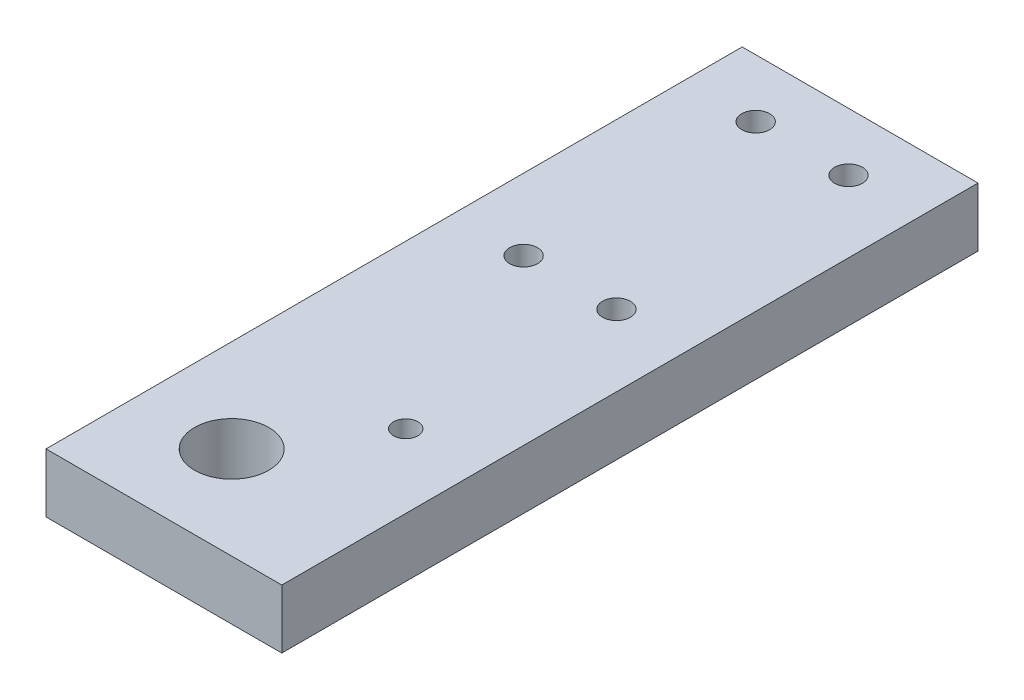
ISO-10303-21;
HEADER;
FILE_DESCRIPTION(('STEP AP214'),'2;1');
FILE_NAME('part.step','',(''),(''),'','','');
FILE_SCHEMA(('AUTOMOTIVE_DESIGN { 1 0 10303 214 1 1 1 1 }'));
ENDSEC;
DATA;
#1=APPLICATION_CONTEXT('core data for automotive mechanical design processes');
#2=APPLICATION_PROTOCOL_DEFINITION('international standard','automotive_design',2000,#1);
#3=PRODUCT_CONTEXT('',#1,'mechanical');
#4=PRODUCT('Part','Part','',(#3));
#5=PRODUCT_RELATED_PRODUCT_CATEGORY('part','',(#4));
#6=PRODUCT_DEFINITION_FORMATION('','',#4);
#7=PRODUCT_DEFINITION_CONTEXT('part definition',#1,'design');
#8=PRODUCT_DEFINITION('design','',#6,#7);
#9=PRODUCT_DEFINITION_SHAPE('','',#8);
#10=(LENGTH_UNIT() NAMED_UNIT(*) SI_UNIT(.MILLI.,.METRE.));
#11=(NAMED_UNIT(*) PLANE_ANGLE_UNIT() SI_UNIT($,.RADIAN.));
#12=(NAMED_UNIT(*) SI_UNIT($,.STERADIAN.) SOLID_ANGLE_UNIT());
#13=UNCERTAINTY_MEASURE_WITH_UNIT(LENGTH_MEASURE(1.E-05),#10,'distance_accuracy_value','');
#14=(GEOMETRIC_REPRESENTATION_CONTEXT(3) GLOBAL_UNCERTAINTY_ASSIGNED_CONTEXT((#13)) GLOBAL_UNIT_ASSIGNED_CONTEXT((#10,
#11,#12)) REPRESENTATION_CONTEXT('',''));
#15=CARTESIAN_POINT('',(0.,0.,0.));
#16=DIRECTION('',(0.,0.,1.));
#17=DIRECTION('',(1.,0.,0.));
#18=AXIS2_PLACEMENT_3D('',#15,#16,#17);
#19=CARTESIAN_POINT('',(0.,25.4,0.));
#20=DIRECTION('',(1.,0.,0.));
#21=DIRECTION('',(0.,0.,-1.));
#22=AXIS2_PLACEMENT_3D('',#19,#20,#21);
#23=PLANE('',#22);
#24=DIRECTION('',(0.,0.,1.));
#25=VECTOR('',#24,1.);
#26=CARTESIAN_POINT('',(0.,0.,0.));
#27=LINE('',#26,#25);
#28=CARTESIAN_POINT('',(0.,0.,-300.));
#29=VERTEX_POINT('',#28);
#30=CARTESIAN_POINT('',(0.,0.,0.));
#31=VERTEX_POINT('',#30);
#32=EDGE_CURVE('E94',#29,#31,#27,.T.);
#33=ORIENTED_EDGE('',*,*,#32,.T.);
#34=DIRECTION('',(0.,-1.,0.));
#35=VECTOR('',#34,1.);
#36=CARTESIAN_POINT('',(0.,25.4,0.));
#37=LINE('',#36,#35);
#38=CARTESIAN_POINT('',(0.,25.4,0.));
#39=VERTEX_POINT('',#38);
#40=EDGE_CURVE('E11',#39,#31,#37,.T.);
#41=ORIENTED_EDGE('',*,*,#40,.F.);
#42=DIRECTION('',(0.,0.,1.));
#43=VECTOR('',#42,1.);
#44=CARTESIAN_POINT('',(0.,25.4,0.));
#45=LINE('',#44,#43);
#46=CARTESIAN_POINT('',(0.,25.4,-300.));
#47=VERTEX_POINT('',#46);
#48=EDGE_CURVE('E82',#47,#39,#45,.T.);
#49=ORIENTED_EDGE('',*,*,#48,.F.);
#50=DIRECTION('',(0.,-1.,0.));
#51=VECTOR('',#50,1.);
#52=CARTESIAN_POINT('',(0.,25.4,-300.));
#53=LINE('',#52,#51);
#54=EDGE_CURVE('E90',#47,#29,#53,.T.);
#55=ORIENTED_EDGE('',*,*,#54,.T.);
#56=EDGE_LOOP('',(#33,#41,#49,#55));
#57=FACE_BOUND('',#56,.T.);
#58=ADVANCED_FACE('F31',(#57),#23,.F.);
#59=CARTESIAN_POINT('',(0.,25.4,0.));
#60=DIRECTION('',(0.,0.,-1.));
#61=DIRECTION('',(-1.,0.,0.));
#62=AXIS2_PLACEMENT_3D('',#59,#60,#61);
#63=PLANE('',#62);
#64=DIRECTION('',(1.,0.,0.));
#65=VECTOR('',#64,1.);
#66=CARTESIAN_POINT('',(0.,0.,0.));
#67=LINE('',#66,#65);
#68=CARTESIAN_POINT('',(101.6,0.,0.));
#69=VERTEX_POINT('',#68);
#70=EDGE_CURVE('E86',#31,#69,#67,.T.);
#71=ORIENTED_EDGE('',*,*,#70,.T.);
#72=DIRECTION('',(0.,-1.,0.));
#73=VECTOR('',#72,1.);
#74=CARTESIAN_POINT('',(101.6,25.4,0.));
#75=LINE('',#74,#73);
#76=CARTESIAN_POINT('',(101.6,25.4,0.));
#77=VERTEX_POINT('',#76);
#78=EDGE_CURVE('E39',#77,#69,#75,.T.);
#79=ORIENTED_EDGE('',*,*,#78,.F.);
#80=DIRECTION('',(1.,0.,0.));
#81=VECTOR('',#80,1.);
#82=CARTESIAN_POINT('',(0.,25.4,0.));
#83=LINE('',#82,#81);
#84=EDGE_CURVE('E77',#39,#77,#83,.T.);
#85=ORIENTED_EDGE('',*,*,#84,.F.);
#86=ORIENTED_EDGE('',*,*,#40,.T.);
#87=EDGE_LOOP('',(#71,#79,#85,#86));
#88=FACE_BOUND('',#87,.T.);
#89=ADVANCED_FACE('F85',(#88),#63,.F.);
#90=CARTESIAN_POINT('',(101.6,25.4,0.));
#91=DIRECTION('',(-1.,0.,0.));
#92=DIRECTION('',(0.,0.,1.));
#93=AXIS2_PLACEMENT_3D('',#90,#91,#92);
#94=PLANE('',#93);
#95=DIRECTION('',(0.,0.,-1.));
#96=VECTOR('',#95,1.);
#97=CARTESIAN_POINT('',(101.6,0.,0.));
#98=LINE('',#97,#96);
#99=CARTESIAN_POINT('',(101.6,0.,-300.));
#100=VERTEX_POINT('',#99);
#101=EDGE_CURVE('E64',#69,#100,#98,.T.);
#102=ORIENTED_EDGE('',*,*,#101,.T.);
#103=DIRECTION('',(0.,-1.,0.));
#104=VECTOR('',#103,1.);
#105=CARTESIAN_POINT('',(101.6,25.4,-300.));
#106=LINE('',#105,#104);
#107=CARTESIAN_POINT('',(101.6,25.4,-300.));
#108=VERTEX_POINT('',#107);
#109=EDGE_CURVE('E87',#108,#100,#106,.T.);
#110=ORIENTED_EDGE('',*,*,#109,.F.);
#111=DIRECTION('',(0.,0.,-1.));
#112=VECTOR('',#111,1.);
#113=CARTESIAN_POINT('',(101.6,25.4,0.));
#114=LINE('',#113,#112);
#115=EDGE_CURVE('E80',#77,#108,#114,.T.);
#116=ORIENTED_EDGE('',*,*,#115,.F.);
#117=ORIENTED_EDGE('',*,*,#78,.T.);
#118=EDGE_LOOP('',(#102,#110,#116,#117));
#119=FACE_BOUND('',#118,.T.);
#120=ADVANCED_FACE('F88',(#119),#94,.F.);
#121=CARTESIAN_POINT('',(0.,25.4,-300.));
#122=DIRECTION('',(0.,0.,1.));
#123=DIRECTION('',(1.,0.,0.));
#124=AXIS2_PLACEMENT_3D('',#121,#122,#123);
#125=PLANE('',#124);
#126=DIRECTION('',(-1.,0.,0.));
#127=VECTOR('',#126,1.);
#128=CARTESIAN_POINT('',(0.,0.,-300.));
#129=LINE('',#128,#127);
#130=EDGE_CURVE('E70',#100,#29,#129,.T.);
#131=ORIENTED_EDGE('',*,*,#130,.T.);
#132=ORIENTED_EDGE('',*,*,#54,.F.);
#133=DIRECTION('',(-1.,0.,0.));
#134=VECTOR('',#133,1.);
#135=CARTESIAN_POINT('',(0.,25.4,-300.));
#136=LINE('',#135,#134);
#137=EDGE_CURVE('E47',#108,#47,#136,.T.);
#138=ORIENTED_EDGE('',*,*,#137,.F.);
#139=ORIENTED_EDGE('',*,*,#109,.T.);
#140=EDGE_LOOP('',(#131,#132,#138,#139));
#141=FACE_BOUND('',#140,.T.);
#142=ADVANCED_FACE('F102',(#141),#125,.F.);
#143=CARTESIAN_POINT('',(0.,25.4,-300.));
#144=DIRECTION('',(0.,-1.,0.));
#145=DIRECTION('',(0.,0.,-1.));
#146=AXIS2_PLACEMENT_3D('',#143,#144,#145);
#147=PLANE('',#146);
#148=CARTESIAN_POINT('',(70.,25.4,-85.));
#149=DIRECTION('',(0.,1.,0.));
#150=DIRECTION('',(0.,0.,1.));
#151=AXIS2_PLACEMENT_3D('',#148,#149,#150);
#152=CIRCLE('',#151,5.25);
#153=CARTESIAN_POINT('',(70.,25.4,-79.75));
#154=VERTEX_POINT('',#153);
#155=EDGE_CURVE('E138',#154,#154,#152,.T.);
#156=ORIENTED_EDGE('',*,*,#155,.F.);
#157=EDGE_LOOP('',(#156));
#158=FACE_BOUND('',#157,.T.);
#159=CARTESIAN_POINT('',(40.,25.4,-40.));
#160=DIRECTION('',(0.,1.,0.));
#161=DIRECTION('',(0.,0.,1.));
#162=AXIS2_PLACEMENT_3D('',#159,#160,#161);
#163=CIRCLE('',#162,16.);
#164=CARTESIAN_POINT('',(40.,25.4,-24.));
#165=VERTEX_POINT('',#164);
#166=EDGE_CURVE('E132',#165,#165,#163,.T.);
#167=ORIENTED_EDGE('',*,*,#166,.F.);
#168=EDGE_LOOP('',(#167));
#169=FACE_BOUND('',#168,.T.);
#170=CARTESIAN_POINT('',(30.8,25.4,-175.));
#171=DIRECTION('',(0.,1.,0.));
#172=DIRECTION('',(0.,0.,1.));
#173=AXIS2_PLACEMENT_3D('',#170,#171,#172);
#174=CIRCLE('',#173,6.);
#175=CARTESIAN_POINT('',(30.8,25.4,-169.));
#176=VERTEX_POINT('',#175);
#177=EDGE_CURVE('E123',#176,#176,#174,.T.);
#178=ORIENTED_EDGE('',*,*,#177,.F.);
#179=EDGE_LOOP('',(#178));
#180=FACE_BOUND('',#179,.T.);
#181=CARTESIAN_POINT('',(70.8,25.4,-175.));
#182=DIRECTION('',(0.,1.,0.));
#183=DIRECTION('',(0.,0.,1.));
#184=AXIS2_PLACEMENT_3D('',#181,#182,#183);
#185=CIRCLE('',#184,6.);
#186=CARTESIAN_POINT('',(70.8,25.4,-169.));
#187=VERTEX_POINT('',#186);
#188=EDGE_CURVE('E117',#187,#187,#185,.T.);
#189=ORIENTED_EDGE('',*,*,#188,.F.);
#190=EDGE_LOOP('',(#189));
#191=FACE_BOUND('',#190,.T.);
#192=CARTESIAN_POINT('',(70.8,25.4,-275.));
#193=DIRECTION('',(0.,1.,0.));
#194=DIRECTION('',(0.,0.,1.));
#195=AXIS2_PLACEMENT_3D('',#192,#193,#194);
#196=CIRCLE('',#195,6.);
#197=CARTESIAN_POINT('',(70.8,25.4,-269.));
#198=VERTEX_POINT('',#197);
#199=EDGE_CURVE('E111',#198,#198,#196,.T.);
#200=ORIENTED_EDGE('',*,*,#199,.F.);
#201=EDGE_LOOP('',(#200));
#202=FACE_BOUND('',#201,.T.);
#203=CARTESIAN_POINT('',(30.8,25.4,-275.));
#204=DIRECTION('',(0.,1.,0.));
#205=DIRECTION('',(0.,0.,1.));
#206=AXIS2_PLACEMENT_3D('',#203,#204,#205);
#207=CIRCLE('',#206,6.);
#208=CARTESIAN_POINT('',(30.8,25.4,-269.));
#209=VERTEX_POINT('',#208);
#210=EDGE_CURVE('E108',#209,#209,#207,.T.);
#211=ORIENTED_EDGE('',*,*,#210,.F.);
#212=EDGE_LOOP('',(#211));
#213=FACE_BOUND('',#212,.T.);
#214=ORIENTED_EDGE('',*,*,#48,.T.);
#215=ORIENTED_EDGE('',*,*,#84,.T.);
#216=ORIENTED_EDGE('',*,*,#115,.T.);
#217=ORIENTED_EDGE('',*,*,#137,.T.);
#218=EDGE_LOOP('',(#214,#215,#216,#217));
#219=FACE_BOUND('',#218,.T.);
#220=ADVANCED_FACE('F78',(#158,#169,#180,#191,#202,#213,#219),#147,.F.);
#221=CARTESIAN_POINT('',(0.,0.,-300.));
#222=DIRECTION('',(0.,-1.,0.));
#223=DIRECTION('',(0.,0.,-1.));
#224=AXIS2_PLACEMENT_3D('',#221,#222,#223);
#225=PLANE('',#224);
#226=CARTESIAN_POINT('',(70.,0.,-85.));
#227=DIRECTION('',(0.,1.,0.));
#228=DIRECTION('',(0.,0.,1.));
#229=AXIS2_PLACEMENT_3D('',#226,#227,#228);
#230=CIRCLE('',#229,5.25);
#231=CARTESIAN_POINT('',(70.,0.,-79.75));
#232=VERTEX_POINT('',#231);
#233=EDGE_CURVE('E135',#232,#232,#230,.T.);
#234=ORIENTED_EDGE('',*,*,#233,.T.);
#235=EDGE_LOOP('',(#234));
#236=FACE_BOUND('',#235,.T.);
#237=CARTESIAN_POINT('',(40.,0.,-40.));
#238=DIRECTION('',(0.,1.,0.));
#239=DIRECTION('',(0.,0.,1.));
#240=AXIS2_PLACEMENT_3D('',#237,#238,#239);
#241=CIRCLE('',#240,16.);
#242=CARTESIAN_POINT('',(40.,0.,-24.));
#243=VERTEX_POINT('',#242);
#244=EDGE_CURVE('E129',#243,#243,#241,.T.);
#245=ORIENTED_EDGE('',*,*,#244,.T.);
#246=EDGE_LOOP('',(#245));
#247=FACE_BOUND('',#246,.T.);
#248=CARTESIAN_POINT('',(30.8,0.,-175.));
#249=DIRECTION('',(0.,1.,0.));
#250=DIRECTION('',(0.,0.,1.));
#251=AXIS2_PLACEMENT_3D('',#248,#249,#250);
#252=CIRCLE('',#251,6.);
#253=CARTESIAN_POINT('',(30.8,0.,-169.));
#254=VERTEX_POINT('',#253);
#255=EDGE_CURVE('E126',#254,#254,#252,.T.);
#256=ORIENTED_EDGE('',*,*,#255,.T.);
#257=EDGE_LOOP('',(#256));
#258=FACE_BOUND('',#257,.T.);
#259=CARTESIAN_POINT('',(70.8,0.,-175.));
#260=DIRECTION('',(0.,1.,0.));
#261=DIRECTION('',(0.,0.,1.));
#262=AXIS2_PLACEMENT_3D('',#259,#260,#261);
#263=CIRCLE('',#262,6.);
#264=CARTESIAN_POINT('',(70.8,0.,-169.));
#265=VERTEX_POINT('',#264);
#266=EDGE_CURVE('E120',#265,#265,#263,.T.);
#267=ORIENTED_EDGE('',*,*,#266,.T.);
#268=EDGE_LOOP('',(#267));
#269=FACE_BOUND('',#268,.T.);
#270=CARTESIAN_POINT('',(70.8,0.,-275.));
#271=DIRECTION('',(0.,1.,0.));
#272=DIRECTION('',(0.,0.,1.));
#273=AXIS2_PLACEMENT_3D('',#270,#271,#272);
#274=CIRCLE('',#273,6.);
#275=CARTESIAN_POINT('',(70.8,0.,-269.));
#276=VERTEX_POINT('',#275);
#277=EDGE_CURVE('E114',#276,#276,#274,.T.);
#278=ORIENTED_EDGE('',*,*,#277,.T.);
#279=EDGE_LOOP('',(#278));
#280=FACE_BOUND('',#279,.T.);
#281=CARTESIAN_POINT('',(30.8,0.,-275.));
#282=DIRECTION('',(0.,1.,0.));
#283=DIRECTION('',(0.,0.,1.));
#284=AXIS2_PLACEMENT_3D('',#281,#282,#283);
#285=CIRCLE('',#284,6.);
#286=CARTESIAN_POINT('',(30.8,0.,-269.));
#287=VERTEX_POINT('',#286);
#288=EDGE_CURVE('E97',#287,#287,#285,.T.);
#289=ORIENTED_EDGE('',*,*,#288,.T.);
#290=EDGE_LOOP('',(#289));
#291=FACE_BOUND('',#290,.T.);
#292=ORIENTED_EDGE('',*,*,#32,.F.);
#293=ORIENTED_EDGE('',*,*,#130,.F.);
#294=ORIENTED_EDGE('',*,*,#101,.F.);
#295=ORIENTED_EDGE('',*,*,#70,.F.);
#296=EDGE_LOOP('',(#292,#293,#294,#295));
#297=FACE_BOUND('',#296,.T.);
#298=ADVANCED_FACE('F105',(#236,#247,#258,#269,#280,#291,#297),#225,.T.);
#299=CARTESIAN_POINT('',(30.8,0.,-275.));
#300=DIRECTION('',(0.,1.,0.));
#301=DIRECTION('',(0.,0.,1.));
#302=AXIS2_PLACEMENT_3D('',#299,#300,#301);
#303=CYLINDRICAL_SURFACE('',#302,6.);
#304=ORIENTED_EDGE('',*,*,#288,.F.);
#305=EDGE_LOOP('',(#304));
#306=FACE_BOUND('',#305,.T.);
#307=ORIENTED_EDGE('',*,*,#210,.T.);
#308=EDGE_LOOP('',(#307));
#309=FACE_BOUND('',#308,.T.);
#310=ADVANCED_FACE('F166',(#306,#309),#303,.F.);
#311=CARTESIAN_POINT('',(70.8,0.,-275.));
#312=DIRECTION('',(0.,1.,0.));
#313=DIRECTION('',(0.,0.,1.));
#314=AXIS2_PLACEMENT_3D('',#311,#312,#313);
#315=CYLINDRICAL_SURFACE('',#314,6.);
#316=ORIENTED_EDGE('',*,*,#277,.F.);
#317=EDGE_LOOP('',(#316));
#318=FACE_BOUND('',#317,.T.);
#319=ORIENTED_EDGE('',*,*,#199,.T.);
#320=EDGE_LOOP('',(#319));
#321=FACE_BOUND('',#320,.T.);
#322=ADVANCED_FACE('F168',(#318,#321),#315,.F.);
#323=CARTESIAN_POINT('',(70.8,0.,-175.));
#324=DIRECTION('',(0.,1.,0.));
#325=DIRECTION('',(0.,0.,1.));
#326=AXIS2_PLACEMENT_3D('',#323,#324,#325);
#327=CYLINDRICAL_SURFACE('',#326,6.);
#328=ORIENTED_EDGE('',*,*,#266,.F.);
#329=EDGE_LOOP('',(#328));
#330=FACE_BOUND('',#329,.T.);
#331=ORIENTED_EDGE('',*,*,#188,.T.);
#332=EDGE_LOOP('',(#331));
#333=FACE_BOUND('',#332,.T.);
#334=ADVANCED_FACE('F175',(#330,#333),#327,.F.);
#335=CARTESIAN_POINT('',(30.8,0.,-175.));
#336=DIRECTION('',(0.,1.,0.));
#337=DIRECTION('',(0.,0.,1.));
#338=AXIS2_PLACEMENT_3D('',#335,#336,#337);
#339=CYLINDRICAL_SURFACE('',#338,6.);
#340=ORIENTED_EDGE('',*,*,#255,.F.);
#341=EDGE_LOOP('',(#340));
#342=FACE_BOUND('',#341,.T.);
#343=ORIENTED_EDGE('',*,*,#177,.T.);
#344=EDGE_LOOP('',(#343));
#345=FACE_BOUND('',#344,.T.);
#346=ADVANCED_FACE('F220',(#342,#345),#339,.F.);
#347=CARTESIAN_POINT('',(40.,0.,-40.));
#348=DIRECTION('',(0.,1.,0.));
#349=DIRECTION('',(0.,0.,1.));
#350=AXIS2_PLACEMENT_3D('',#347,#348,#349);
#351=CYLINDRICAL_SURFACE('',#350,16.);
#352=ORIENTED_EDGE('',*,*,#244,.F.);
#353=EDGE_LOOP('',(#352));
#354=FACE_BOUND('',#353,.T.);
#355=ORIENTED_EDGE('',*,*,#166,.T.);
#356=EDGE_LOOP('',(#355));
#357=FACE_BOUND('',#356,.T.);
#358=ADVANCED_FACE('F149',(#354,#357),#351,.F.);
#359=CARTESIAN_POINT('',(70.,0.,-85.));
#360=DIRECTION('',(0.,1.,0.));
#361=DIRECTION('',(0.,0.,1.));
#362=AXIS2_PLACEMENT_3D('',#359,#360,#361);
#363=CYLINDRICAL_SURFACE('',#362,5.25);
#364=ORIENTED_EDGE('',*,*,#233,.F.);
#365=EDGE_LOOP('',(#364));
#366=FACE_BOUND('',#365,.T.);
#367=ORIENTED_EDGE('',*,*,#155,.T.);
#368=EDGE_LOOP('',(#367));
#369=FACE_BOUND('',#368,.T.);
#370=ADVANCED_FACE('F146',(#366,#369),#363,.F.);
#371=CLOSED_SHELL('',(#58,#89,#120,#142,#220,#298,#310,#322,#334,#346,#358,#370));
#372=MANIFOLD_SOLID_BREP('B2',#371);
#373=ADVANCED_BREP_SHAPE_REPRESENTATION('',(#18,#372),#14);
#374=SHAPE_DEFINITION_REPRESENTATION(#9,#373);
ENDSEC;
END-ISO-10303-21;
